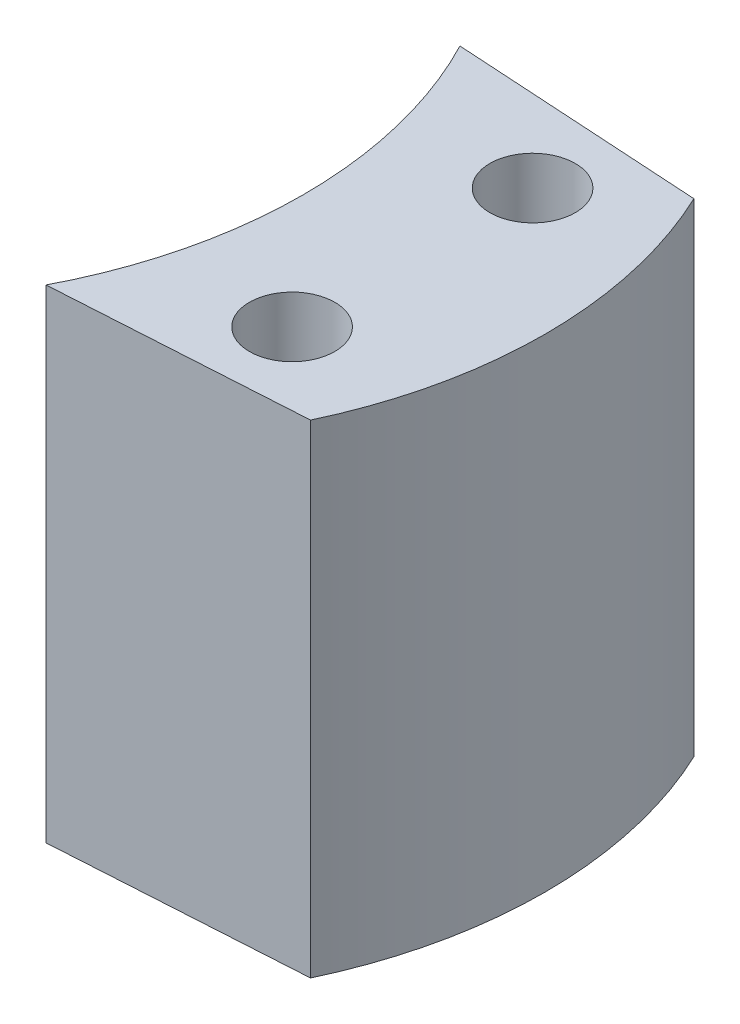
ISO-10303-21;
HEADER;
FILE_DESCRIPTION(('STEP AP214'),'2;1');
FILE_NAME('part.step','',(''),(''),'','','');
FILE_SCHEMA(('AUTOMOTIVE_DESIGN { 1 0 10303 214 1 1 1 1 }'));
ENDSEC;
DATA;
#1=APPLICATION_CONTEXT('core data for automotive mechanical design processes');
#2=APPLICATION_PROTOCOL_DEFINITION('international standard','automotive_design',2000,#1);
#3=PRODUCT_CONTEXT('',#1,'mechanical');
#4=PRODUCT('Part','Part','',(#3));
#5=PRODUCT_RELATED_PRODUCT_CATEGORY('part','',(#4));
#6=PRODUCT_DEFINITION_FORMATION('','',#4);
#7=PRODUCT_DEFINITION_CONTEXT('part definition',#1,'design');
#8=PRODUCT_DEFINITION('design','',#6,#7);
#9=PRODUCT_DEFINITION_SHAPE('','',#8);
#10=(LENGTH_UNIT() NAMED_UNIT(*) SI_UNIT(.MILLI.,.METRE.));
#11=(NAMED_UNIT(*) PLANE_ANGLE_UNIT() SI_UNIT($,.RADIAN.));
#12=(NAMED_UNIT(*) SI_UNIT($,.STERADIAN.) SOLID_ANGLE_UNIT());
#13=UNCERTAINTY_MEASURE_WITH_UNIT(LENGTH_MEASURE(1.E-05),#10,'distance_accuracy_value','');
#14=(GEOMETRIC_REPRESENTATION_CONTEXT(3) GLOBAL_UNCERTAINTY_ASSIGNED_CONTEXT((#13)) GLOBAL_UNIT_ASSIGNED_CONTEXT((#10,
#11,#12)) REPRESENTATION_CONTEXT('',''));
#15=CARTESIAN_POINT('',(0.,0.,0.));
#16=DIRECTION('',(0.,0.,1.));
#17=DIRECTION('',(1.,0.,0.));
#18=AXIS2_PLACEMENT_3D('',#15,#16,#17);
#19=CARTESIAN_POINT('',(-7.,21.5,0.));
#20=DIRECTION('',(0.,1.,0.));
#21=DIRECTION('',(0.,0.,1.));
#22=AXIS2_PLACEMENT_3D('',#19,#20,#21);
#23=PLANE('',#22);
#24=CARTESIAN_POINT('',(7.08975124207074,21.5,5.35));
#25=DIRECTION('',(0.,1.,0.));
#26=DIRECTION('',(0.,0.,1.));
#27=AXIS2_PLACEMENT_3D('',#24,#25,#26);
#28=CIRCLE('',#27,1.9);
#29=CARTESIAN_POINT('',(7.08975124207074,21.5,7.25));
#30=VERTEX_POINT('',#29);
#31=EDGE_CURVE('E102',#30,#30,#28,.T.);
#32=ORIENTED_EDGE('',*,*,#31,.F.);
#33=EDGE_LOOP('',(#32));
#34=FACE_BOUND('',#33,.T.);
#35=CARTESIAN_POINT('',(-7.,21.5,0.));
#36=DIRECTION('',(0.,1.,0.));
#37=DIRECTION('',(0.,0.,1.));
#38=AXIS2_PLACEMENT_3D('',#35,#36,#37);
#39=CIRCLE('',#38,20.);
#40=CARTESIAN_POINT('',(11.0897512420707,21.5,8.53));
#41=VERTEX_POINT('',#40);
#42=CARTESIAN_POINT('',(11.0897512420707,21.5,-8.53));
#43=VERTEX_POINT('',#42);
#44=EDGE_CURVE('E87',#41,#43,#39,.T.);
#45=ORIENTED_EDGE('',*,*,#44,.T.);
#46=DIRECTION('',(-0.998134798421867,0.,-0.0610485395348529));
#47=VECTOR('',#46,1.);
#48=CARTESIAN_POINT('',(0.,21.5,-9.20827824278209));
#49=LINE('',#48,#47);
#50=CARTESIAN_POINT('',(0.,21.5,-9.20827824278209));
#51=VERTEX_POINT('',#50);
#52=EDGE_CURVE('E82',#43,#51,#49,.T.);
#53=ORIENTED_EDGE('',*,*,#52,.T.);
#54=CARTESIAN_POINT('',(-17.7540871858709,21.5,0.));
#55=DIRECTION('',(0.,-1.,0.));
#56=DIRECTION('',(0.,0.,1.));
#57=AXIS2_PLACEMENT_3D('',#54,#55,#56);
#58=CIRCLE('',#57,20.);
#59=CARTESIAN_POINT('',(0.,21.5,9.20827824278209));
#60=VERTEX_POINT('',#59);
#61=EDGE_CURVE('E85',#51,#60,#58,.T.);
#62=ORIENTED_EDGE('',*,*,#61,.T.);
#63=DIRECTION('',(0.998134798421867,0.,-0.0610485395348529));
#64=VECTOR('',#63,1.);
#65=CARTESIAN_POINT('',(0.,21.5,9.20827824278209));
#66=LINE('',#65,#64);
#67=EDGE_CURVE('E52',#60,#41,#66,.T.);
#68=ORIENTED_EDGE('',*,*,#67,.T.);
#69=EDGE_LOOP('',(#45,#53,#62,#68));
#70=FACE_BOUND('',#69,.T.);
#71=CARTESIAN_POINT('',(7.08975124207074,21.5,-5.35));
#72=DIRECTION('',(0.,1.,0.));
#73=DIRECTION('',(0.,0.,1.));
#74=AXIS2_PLACEMENT_3D('',#71,#72,#73);
#75=CIRCLE('',#74,1.9);
#76=CARTESIAN_POINT('',(7.08975124207074,21.5,-3.45));
#77=VERTEX_POINT('',#76);
#78=EDGE_CURVE('E117',#77,#77,#75,.T.);
#79=ORIENTED_EDGE('',*,*,#78,.F.);
#80=EDGE_LOOP('',(#79));
#81=FACE_BOUND('',#80,.T.);
#82=ADVANCED_FACE('F35',(#34,#70,#81),#23,.T.);
#83=CARTESIAN_POINT('',(-7.,0.,0.));
#84=DIRECTION('',(0.,1.,0.));
#85=DIRECTION('',(0.,0.,1.));
#86=AXIS2_PLACEMENT_3D('',#83,#84,#85);
#87=PLANE('',#86);
#88=CARTESIAN_POINT('',(-7.,0.,0.));
#89=DIRECTION('',(0.,1.,0.));
#90=DIRECTION('',(0.,0.,1.));
#91=AXIS2_PLACEMENT_3D('',#88,#89,#90);
#92=CIRCLE('',#91,20.);
#93=CARTESIAN_POINT('',(11.0897512420707,0.,8.53));
#94=VERTEX_POINT('',#93);
#95=CARTESIAN_POINT('',(11.0897512420707,0.,-8.53));
#96=VERTEX_POINT('',#95);
#97=EDGE_CURVE('E99',#94,#96,#92,.T.);
#98=ORIENTED_EDGE('',*,*,#97,.F.);
#99=DIRECTION('',(0.998134798421867,0.,-0.0610485395348529));
#100=VECTOR('',#99,1.);
#101=CARTESIAN_POINT('',(0.,0.,9.20827824278209));
#102=LINE('',#101,#100);
#103=CARTESIAN_POINT('',(0.,0.,9.20827824278209));
#104=VERTEX_POINT('',#103);
#105=EDGE_CURVE('E75',#104,#94,#102,.T.);
#106=ORIENTED_EDGE('',*,*,#105,.F.);
#107=CARTESIAN_POINT('',(-17.7540871858709,0.,0.));
#108=DIRECTION('',(0.,-1.,0.));
#109=DIRECTION('',(0.,0.,1.));
#110=AXIS2_PLACEMENT_3D('',#107,#108,#109);
#111=CIRCLE('',#110,20.);
#112=CARTESIAN_POINT('',(0.,0.,-9.20827824278209));
#113=VERTEX_POINT('',#112);
#114=EDGE_CURVE('E69',#113,#104,#111,.T.);
#115=ORIENTED_EDGE('',*,*,#114,.F.);
#116=DIRECTION('',(-0.998134798421867,0.,-0.0610485395348529));
#117=VECTOR('',#116,1.);
#118=CARTESIAN_POINT('',(0.,0.,-9.20827824278209));
#119=LINE('',#118,#117);
#120=EDGE_CURVE('E91',#96,#113,#119,.T.);
#121=ORIENTED_EDGE('',*,*,#120,.F.);
#122=EDGE_LOOP('',(#98,#106,#115,#121));
#123=FACE_BOUND('',#122,.T.);
#124=CARTESIAN_POINT('',(7.08975124207074,0.,5.35));
#125=DIRECTION('',(0.,1.,0.));
#126=DIRECTION('',(0.,0.,1.));
#127=AXIS2_PLACEMENT_3D('',#124,#125,#126);
#128=CIRCLE('',#127,1.9);
#129=CARTESIAN_POINT('',(7.08975124207074,0.,7.25));
#130=VERTEX_POINT('',#129);
#131=EDGE_CURVE('E114',#130,#130,#128,.T.);
#132=ORIENTED_EDGE('',*,*,#131,.T.);
#133=EDGE_LOOP('',(#132));
#134=FACE_BOUND('',#133,.T.);
#135=CARTESIAN_POINT('',(7.08975124207074,0.,-5.35));
#136=DIRECTION('',(0.,1.,0.));
#137=DIRECTION('',(0.,0.,1.));
#138=AXIS2_PLACEMENT_3D('',#135,#136,#137);
#139=CIRCLE('',#138,1.9);
#140=CARTESIAN_POINT('',(7.08975124207074,0.,-3.45));
#141=VERTEX_POINT('',#140);
#142=EDGE_CURVE('E120',#141,#141,#139,.T.);
#143=ORIENTED_EDGE('',*,*,#142,.T.);
#144=EDGE_LOOP('',(#143));
#145=FACE_BOUND('',#144,.T.);
#146=ADVANCED_FACE('F110',(#123,#134,#145),#87,.F.);
#147=CARTESIAN_POINT('',(-7.,21.5,0.));
#148=DIRECTION('',(0.,-1.,0.));
#149=DIRECTION('',(0.,0.,-1.));
#150=AXIS2_PLACEMENT_3D('',#147,#148,#149);
#151=CYLINDRICAL_SURFACE('',#150,20.);
#152=ORIENTED_EDGE('',*,*,#97,.T.);
#153=DIRECTION('',(0.,-1.,0.));
#154=VECTOR('',#153,1.);
#155=CARTESIAN_POINT('',(11.0897512420707,21.5,-8.53));
#156=LINE('',#155,#154);
#157=EDGE_CURVE('E11',#43,#96,#156,.T.);
#158=ORIENTED_EDGE('',*,*,#157,.F.);
#159=ORIENTED_EDGE('',*,*,#44,.F.);
#160=DIRECTION('',(0.,-1.,0.));
#161=VECTOR('',#160,1.);
#162=CARTESIAN_POINT('',(11.0897512420707,21.5,8.53));
#163=LINE('',#162,#161);
#164=EDGE_CURVE('E95',#41,#94,#163,.T.);
#165=ORIENTED_EDGE('',*,*,#164,.T.);
#166=EDGE_LOOP('',(#152,#158,#159,#165));
#167=FACE_BOUND('',#166,.T.);
#168=ADVANCED_FACE('F37',(#167),#151,.T.);
#169=CARTESIAN_POINT('',(0.,21.5,-9.20827824278209));
#170=DIRECTION('',(-0.0610485395348529,0.,0.998134798421867));
#171=DIRECTION('',(0.998134798421867,0.,0.0610485395348529));
#172=AXIS2_PLACEMENT_3D('',#169,#170,#171);
#173=PLANE('',#172);
#174=ORIENTED_EDGE('',*,*,#120,.T.);
#175=DIRECTION('',(0.,-1.,0.));
#176=VECTOR('',#175,1.);
#177=CARTESIAN_POINT('',(0.,21.5,-9.20827824278209));
#178=LINE('',#177,#176);
#179=EDGE_CURVE('E44',#51,#113,#178,.T.);
#180=ORIENTED_EDGE('',*,*,#179,.F.);
#181=ORIENTED_EDGE('',*,*,#52,.F.);
#182=ORIENTED_EDGE('',*,*,#157,.T.);
#183=EDGE_LOOP('',(#174,#180,#181,#182));
#184=FACE_BOUND('',#183,.T.);
#185=ADVANCED_FACE('F90',(#184),#173,.F.);
#186=CARTESIAN_POINT('',(-17.7540871858709,21.5,0.));
#187=DIRECTION('',(0.,-1.,0.));
#188=DIRECTION('',(0.,0.,-1.));
#189=AXIS2_PLACEMENT_3D('',#186,#187,#188);
#190=CYLINDRICAL_SURFACE('',#189,20.);
#191=ORIENTED_EDGE('',*,*,#114,.T.);
#192=DIRECTION('',(0.,-1.,0.));
#193=VECTOR('',#192,1.);
#194=CARTESIAN_POINT('',(0.,21.5,9.20827824278209));
#195=LINE('',#194,#193);
#196=EDGE_CURVE('E92',#60,#104,#195,.T.);
#197=ORIENTED_EDGE('',*,*,#196,.F.);
#198=ORIENTED_EDGE('',*,*,#61,.F.);
#199=ORIENTED_EDGE('',*,*,#179,.T.);
#200=EDGE_LOOP('',(#191,#197,#198,#199));
#201=FACE_BOUND('',#200,.T.);
#202=ADVANCED_FACE('F93',(#201),#190,.F.);
#203=CARTESIAN_POINT('',(0.,21.5,9.20827824278209));
#204=DIRECTION('',(-0.0610485395348529,0.,-0.998134798421867));
#205=DIRECTION('',(-0.998134798421867,0.,0.0610485395348529));
#206=AXIS2_PLACEMENT_3D('',#203,#204,#205);
#207=PLANE('',#206);
#208=ORIENTED_EDGE('',*,*,#105,.T.);
#209=ORIENTED_EDGE('',*,*,#164,.F.);
#210=ORIENTED_EDGE('',*,*,#67,.F.);
#211=ORIENTED_EDGE('',*,*,#196,.T.);
#212=EDGE_LOOP('',(#208,#209,#210,#211));
#213=FACE_BOUND('',#212,.T.);
#214=ADVANCED_FACE('F107',(#213),#207,.F.);
#215=CARTESIAN_POINT('',(7.08975124207074,21.5,5.35));
#216=DIRECTION('',(0.,-1.,0.));
#217=DIRECTION('',(0.,0.,-1.));
#218=AXIS2_PLACEMENT_3D('',#215,#216,#217);
#219=CYLINDRICAL_SURFACE('',#218,1.9);
#220=ORIENTED_EDGE('',*,*,#31,.T.);
#221=EDGE_LOOP('',(#220));
#222=FACE_BOUND('',#221,.T.);
#223=ORIENTED_EDGE('',*,*,#131,.F.);
#224=EDGE_LOOP('',(#223));
#225=FACE_BOUND('',#224,.T.);
#226=ADVANCED_FACE('F137',(#222,#225),#219,.F.);
#227=CARTESIAN_POINT('',(7.08975124207074,21.5,-5.35));
#228=DIRECTION('',(0.,-1.,0.));
#229=DIRECTION('',(0.,0.,-1.));
#230=AXIS2_PLACEMENT_3D('',#227,#228,#229);
#231=CYLINDRICAL_SURFACE('',#230,1.9);
#232=ORIENTED_EDGE('',*,*,#78,.T.);
#233=EDGE_LOOP('',(#232));
#234=FACE_BOUND('',#233,.T.);
#235=ORIENTED_EDGE('',*,*,#142,.F.);
#236=EDGE_LOOP('',(#235));
#237=FACE_BOUND('',#236,.T.);
#238=ADVANCED_FACE('F126',(#234,#237),#231,.F.);
#239=CLOSED_SHELL('',(#82,#146,#168,#185,#202,#214,#226,#238));
#240=MANIFOLD_SOLID_BREP('B2',#239);
#241=ADVANCED_BREP_SHAPE_REPRESENTATION('',(#18,#240),#14);
#242=SHAPE_DEFINITION_REPRESENTATION(#9,#241);
ENDSEC;
END-ISO-10303-21;
